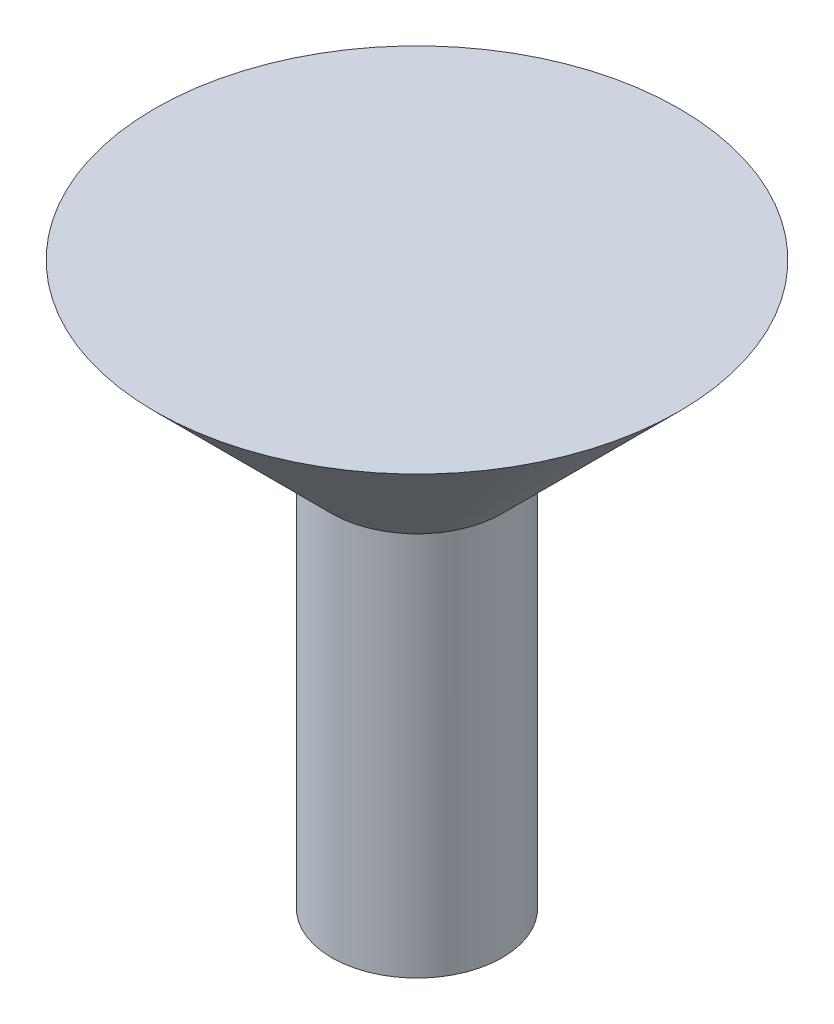
ISO-10303-21;
HEADER;
FILE_DESCRIPTION(('STEP AP214'),'2;1');
FILE_NAME('part.step','',(''),(''),'','','');
FILE_SCHEMA(('AUTOMOTIVE_DESIGN { 1 0 10303 214 1 1 1 1 }'));
ENDSEC;
DATA;
#1=APPLICATION_CONTEXT('core data for automotive mechanical design processes');
#2=APPLICATION_PROTOCOL_DEFINITION('international standard','automotive_design',2000,#1);
#3=PRODUCT_CONTEXT('',#1,'mechanical');
#4=PRODUCT('Part','Part','',(#3));
#5=PRODUCT_RELATED_PRODUCT_CATEGORY('part','',(#4));
#6=PRODUCT_DEFINITION_FORMATION('','',#4);
#7=PRODUCT_DEFINITION_CONTEXT('part definition',#1,'design');
#8=PRODUCT_DEFINITION('design','',#6,#7);
#9=PRODUCT_DEFINITION_SHAPE('','',#8);
#10=(LENGTH_UNIT() NAMED_UNIT(*) SI_UNIT(.MILLI.,.METRE.));
#11=(NAMED_UNIT(*) PLANE_ANGLE_UNIT() SI_UNIT($,.RADIAN.));
#12=(NAMED_UNIT(*) SI_UNIT($,.STERADIAN.) SOLID_ANGLE_UNIT());
#13=UNCERTAINTY_MEASURE_WITH_UNIT(LENGTH_MEASURE(1.E-05),#10,'distance_accuracy_value','');
#14=(GEOMETRIC_REPRESENTATION_CONTEXT(3) GLOBAL_UNCERTAINTY_ASSIGNED_CONTEXT((#13)) GLOBAL_UNIT_ASSIGNED_CONTEXT((#10,
#11,#12)) REPRESENTATION_CONTEXT('',''));
#15=CARTESIAN_POINT('',(0.,0.,0.));
#16=DIRECTION('',(0.,0.,1.));
#17=DIRECTION('',(1.,0.,0.));
#18=AXIS2_PLACEMENT_3D('',#15,#16,#17);
#19=CARTESIAN_POINT('',(-7.01715728752538,2.3,0.));
#20=DIRECTION('',(0.,1.,0.));
#21=DIRECTION('',(0.,0.,1.));
#22=AXIS2_PLACEMENT_3D('',#19,#20,#21);
#23=PLANE('',#22);
#24=CARTESIAN_POINT('',(-0.199999999999999,2.3,0.));
#25=DIRECTION('',(0.,1.,0.));
#26=DIRECTION('',(0.,0.,1.));
#27=AXIS2_PLACEMENT_3D('',#24,#25,#26);
#28=CIRCLE('',#27,6.81715728752538);
#29=CARTESIAN_POINT('',(-0.199999999999999,2.3,6.81715728752538));
#30=VERTEX_POINT('',#29);
#31=EDGE_CURVE('E10',#30,#30,#28,.T.);
#32=ORIENTED_EDGE('',*,*,#31,.T.);
#33=EDGE_LOOP('',(#32));
#34=FACE_BOUND('',#33,.T.);
#35=ADVANCED_FACE('F37',(#34),#23,.T.);
#36=CARTESIAN_POINT('',(-0.199999999999999,2.3,0.));
#37=DIRECTION('',(0.,1.,0.));
#38=DIRECTION('',(0.,0.,1.));
#39=AXIS2_PLACEMENT_3D('',#36,#37,#38);
#40=CONICAL_SURFACE('',#39,6.81715728752538,0.785398163397448);
#41=CARTESIAN_POINT('',(-0.199999999999999,-2.3,0.));
#42=DIRECTION('',(0.,-1.,0.));
#43=DIRECTION('',(0.,0.,-1.));
#44=AXIS2_PLACEMENT_3D('',#41,#42,#43);
#45=CIRCLE('',#44,2.21715728752538);
#46=CARTESIAN_POINT('',(-0.199999999999999,-2.3,2.21715728752538));
#47=VERTEX_POINT('',#46);
#48=EDGE_CURVE('E47',#47,#47,#45,.T.);
#49=CARTESIAN_POINT('',(-0.199999999999999,-2.3,2.21715728752538));
#50=CARTESIAN_POINT('',(-0.199999999999999,-2.25208333333333,2.26507395419205));
#51=CARTESIAN_POINT('',(-0.199999999999999,-2.20416666666667,2.31299062085871));
#52=CARTESIAN_POINT('',(-0.199999999999999,-2.10833333333333,2.40882395419205));
#53=CARTESIAN_POINT('',(-0.199999999999999,-2.06041666666667,2.45674062085871));
#54=CARTESIAN_POINT('',(-0.199999999999999,-1.96458333333333,2.55257395419205));
#55=CARTESIAN_POINT('',(-0.199999999999999,-1.91666666666667,2.60049062085871));
#56=CARTESIAN_POINT('',(-0.199999999999999,-1.82083333333333,2.69632395419205));
#57=CARTESIAN_POINT('',(-0.199999999999999,-1.77291666666667,2.74424062085871));
#58=CARTESIAN_POINT('',(-0.199999999999999,-1.67708333333333,2.84007395419205));
#59=CARTESIAN_POINT('',(-0.199999999999999,-1.62916666666667,2.88799062085871));
#60=CARTESIAN_POINT('',(-0.199999999999999,-1.53333333333333,2.98382395419205));
#61=CARTESIAN_POINT('',(-0.199999999999999,-1.48541666666667,3.03174062085871));
#62=CARTESIAN_POINT('',(-0.199999999999999,-1.38958333333333,3.12757395419205));
#63=CARTESIAN_POINT('',(-0.199999999999999,-1.34166666666667,3.17549062085871));
#64=CARTESIAN_POINT('',(-0.199999999999999,-1.24583333333333,3.27132395419205));
#65=CARTESIAN_POINT('',(-0.199999999999999,-1.19791666666667,3.31924062085871));
#66=CARTESIAN_POINT('',(-0.199999999999999,-1.10208333333333,3.41507395419205));
#67=CARTESIAN_POINT('',(-0.199999999999999,-1.05416666666667,3.46299062085871));
#68=CARTESIAN_POINT('',(-0.199999999999999,-0.958333333333333,3.55882395419205));
#69=CARTESIAN_POINT('',(-0.199999999999999,-0.910416666666667,3.60674062085871));
#70=CARTESIAN_POINT('',(-0.199999999999999,-0.814583333333333,3.70257395419205));
#71=CARTESIAN_POINT('',(-0.199999999999999,-0.766666666666666,3.75049062085871));
#72=CARTESIAN_POINT('',(-0.199999999999999,-0.670833333333333,3.84632395419205));
#73=CARTESIAN_POINT('',(-0.199999999999999,-0.622916666666667,3.89424062085871));
#74=CARTESIAN_POINT('',(-0.199999999999999,-0.527083333333333,3.99007395419205));
#75=CARTESIAN_POINT('',(-0.199999999999999,-0.479166666666667,4.03799062085871));
#76=CARTESIAN_POINT('',(-0.199999999999999,-0.383333333333333,4.13382395419205));
#77=CARTESIAN_POINT('',(-0.199999999999999,-0.335416666666667,4.18174062085872));
#78=CARTESIAN_POINT('',(-0.199999999999999,-0.239583333333333,4.27757395419205));
#79=CARTESIAN_POINT('',(-0.199999999999999,-0.191666666666667,4.32549062085871));
#80=CARTESIAN_POINT('',(-0.199999999999999,-0.0958333333333331,4.42132395419205));
#81=CARTESIAN_POINT('',(-0.199999999999999,-0.0479166666666666,4.46924062085871));
#82=CARTESIAN_POINT('',(-0.199999999999999,0.0479166666666666,4.56507395419205));
#83=CARTESIAN_POINT('',(-0.199999999999999,0.0958333333333331,4.61299062085871));
#84=CARTESIAN_POINT('',(-0.199999999999999,0.191666666666667,4.70882395419205));
#85=CARTESIAN_POINT('',(-0.199999999999999,0.239583333333333,4.75674062085871));
#86=CARTESIAN_POINT('',(-0.199999999999999,0.335416666666667,4.85257395419205));
#87=CARTESIAN_POINT('',(-0.199999999999999,0.383333333333333,4.90049062085871));
#88=CARTESIAN_POINT('',(-0.199999999999999,0.479166666666667,4.99632395419205));
#89=CARTESIAN_POINT('',(-0.199999999999999,0.527083333333333,5.04424062085871));
#90=CARTESIAN_POINT('',(-0.199999999999999,0.622916666666667,5.14007395419205));
#91=CARTESIAN_POINT('',(-0.199999999999999,0.670833333333333,5.18799062085871));
#92=CARTESIAN_POINT('',(-0.199999999999999,0.766666666666666,5.28382395419205));
#93=CARTESIAN_POINT('',(-0.199999999999999,0.814583333333333,5.33174062085871));
#94=CARTESIAN_POINT('',(-0.199999999999999,0.910416666666667,5.42757395419205));
#95=CARTESIAN_POINT('',(-0.199999999999999,0.958333333333333,5.47549062085871));
#96=CARTESIAN_POINT('',(-0.199999999999999,1.05416666666667,5.57132395419205));
#97=CARTESIAN_POINT('',(-0.199999999999999,1.10208333333333,5.61924062085871));
#98=CARTESIAN_POINT('',(-0.199999999999999,1.19791666666667,5.71507395419205));
#99=CARTESIAN_POINT('',(-0.199999999999999,1.24583333333333,5.76299062085871));
#100=CARTESIAN_POINT('',(-0.199999999999999,1.34166666666667,5.85882395419205));
#101=CARTESIAN_POINT('',(-0.199999999999999,1.38958333333333,5.90674062085871));
#102=CARTESIAN_POINT('',(-0.199999999999999,1.48541666666667,6.00257395419205));
#103=CARTESIAN_POINT('',(-0.199999999999999,1.53333333333333,6.05049062085871));
#104=CARTESIAN_POINT('',(-0.199999999999999,1.62916666666667,6.14632395419205));
#105=CARTESIAN_POINT('',(-0.199999999999999,1.67708333333333,6.19424062085871));
#106=CARTESIAN_POINT('',(-0.199999999999999,1.77291666666667,6.29007395419205));
#107=CARTESIAN_POINT('',(-0.199999999999999,1.82083333333333,6.33799062085871));
#108=CARTESIAN_POINT('',(-0.199999999999999,1.91666666666667,6.43382395419205));
#109=CARTESIAN_POINT('',(-0.199999999999999,1.96458333333333,6.48174062085871));
#110=CARTESIAN_POINT('',(-0.199999999999999,2.06041666666667,6.57757395419205));
#111=CARTESIAN_POINT('',(-0.199999999999999,2.10833333333333,6.62549062085871));
#112=CARTESIAN_POINT('',(-0.199999999999999,2.20416666666667,6.72132395419205));
#113=CARTESIAN_POINT('',(-0.199999999999999,2.25208333333333,6.76924062085871));
#114=CARTESIAN_POINT('',(-0.199999999999999,2.3,6.81715728752538));
#115=B_SPLINE_CURVE_WITH_KNOTS('',3,(#49,#50,#51,#52,#53,#54,#55,#56,#57,#58,#59,#60,#61,#62,
#63,#64,#65,#66,#67,#68,#69,#70,#71,#72,#73,#74,#75,#76,#77,#78,#79,#80,#81,#82,#83,#84,#85,#86,
#87,#88,#89,#90,#91,#92,#93,#94,#95,#96,#97,#98,#99,#100,#101,#102,#103,#104,#105,#106,#107,
#108,#109,#110,#111,#112,#113,#114),.UNSPECIFIED.,.F.,.F.,(4,2,2,2,2,2,2,2,2,2,2,2,2,2,2,2,2,2,
2,2,2,2,2,2,2,2,2,2,2,2,2,2,4),(0.,0.203293199591132,0.406586399182264,0.609879598773397,
0.81317279836453,1.01646599795566,1.21975919754679,1.42305239713793,1.62634559672906,
1.82963879632019,2.03293199591132,2.23622519550246,2.43951839509359,2.64281159468472,
2.84610479427585,3.04939799386699,3.25269119345812,3.45598439304925,3.65927759264038,
3.86257079223152,4.06586399182265,4.26915719141378,4.47245039100491,4.67574359059604,
4.87903679018718,5.08232998977831,5.28562318936944,5.48891638896057,5.69220958855171,
5.89550278814284,6.09879598773397,6.3020891873251,6.50538238691624),.UNSPECIFIED.);
#116=EDGE_CURVE('BSEAM75',#47,#30,#115,.T.);
#117=ORIENTED_EDGE('',*,*,#48,.F.);
#118=ORIENTED_EDGE('',*,*,#31,.F.);
#119=ORIENTED_EDGE('',*,*,#116,.T.);
#120=ORIENTED_EDGE('',*,*,#116,.F.);
#121=EDGE_LOOP('',(#117,#119,#118,#120));
#122=FACE_BOUND('',#121,.T.);
#123=ADVANCED_FACE('F75',(#122),#40,.T.);
#124=CARTESIAN_POINT('',(-0.199999999999999,-12.3,0.));
#125=DIRECTION('',(0.,1.,0.));
#126=DIRECTION('',(0.,0.,1.));
#127=AXIS2_PLACEMENT_3D('',#124,#125,#126);
#128=CYLINDRICAL_SURFACE('',#127,2.21715728752538);
#129=CARTESIAN_POINT('',(-0.199999999999999,-12.3,0.));
#130=DIRECTION('',(0.,-1.,0.));
#131=DIRECTION('',(0.,0.,-1.));
#132=AXIS2_PLACEMENT_3D('',#129,#130,#131);
#133=CIRCLE('',#132,2.21715728752538);
#134=CARTESIAN_POINT('',(-0.199999999999999,-12.3,-2.21715728752538));
#135=VERTEX_POINT('',#134);
#136=EDGE_CURVE('E43',#135,#135,#133,.T.);
#137=ORIENTED_EDGE('',*,*,#136,.F.);
#138=EDGE_LOOP('',(#137));
#139=FACE_BOUND('',#138,.T.);
#140=ORIENTED_EDGE('',*,*,#48,.T.);
#141=EDGE_LOOP('',(#140));
#142=FACE_BOUND('',#141,.T.);
#143=ADVANCED_FACE('F70',(#139,#142),#128,.T.);
#144=CARTESIAN_POINT('',(-0.199999999999999,-12.3,0.));
#145=DIRECTION('',(0.,-1.,0.));
#146=DIRECTION('',(0.,0.,-1.));
#147=AXIS2_PLACEMENT_3D('',#144,#145,#146);
#148=PLANE('',#147);
#149=CARTESIAN_POINT('',(-0.199999999999999,-12.3,0.));
#150=DIRECTION('',(0.,-1.,0.));
#151=DIRECTION('',(0.,0.,-1.));
#152=AXIS2_PLACEMENT_3D('',#149,#150,#151);
#153=CIRCLE('',#152,1.5);
#154=CARTESIAN_POINT('',(-0.199999999999999,-12.3,-1.5));
#155=VERTEX_POINT('',#154);
#156=EDGE_CURVE('E54',#155,#155,#153,.T.);
#157=ORIENTED_EDGE('',*,*,#156,.F.);
#158=EDGE_LOOP('',(#157));
#159=FACE_BOUND('',#158,.T.);
#160=ORIENTED_EDGE('',*,*,#136,.T.);
#161=EDGE_LOOP('',(#160));
#162=FACE_BOUND('',#161,.T.);
#163=ADVANCED_FACE('F65',(#159,#162),#148,.T.);
#164=CARTESIAN_POINT('',(-0.199999999999999,-7.3,0.));
#165=DIRECTION('',(0.,-1.,0.));
#166=DIRECTION('',(0.,0.,-1.));
#167=AXIS2_PLACEMENT_3D('',#164,#165,#166);
#168=CYLINDRICAL_SURFACE('',#167,1.5);
#169=CARTESIAN_POINT('',(-0.199999999999999,-7.3,0.));
#170=DIRECTION('',(0.,-1.,0.));
#171=DIRECTION('',(0.,0.,-1.));
#172=AXIS2_PLACEMENT_3D('',#169,#170,#171);
#173=CIRCLE('',#172,1.5);
#174=CARTESIAN_POINT('',(-0.199999999999999,-7.3,-1.5));
#175=VERTEX_POINT('',#174);
#176=EDGE_CURVE('E52',#175,#175,#173,.T.);
#177=ORIENTED_EDGE('',*,*,#176,.F.);
#178=EDGE_LOOP('',(#177));
#179=FACE_BOUND('',#178,.T.);
#180=ORIENTED_EDGE('',*,*,#156,.T.);
#181=EDGE_LOOP('',(#180));
#182=FACE_BOUND('',#181,.T.);
#183=ADVANCED_FACE('F62',(#179,#182),#168,.F.);
#184=CARTESIAN_POINT('',(-0.199999999999999,-7.3,0.));
#185=DIRECTION('',(0.,-1.,0.));
#186=DIRECTION('',(0.,0.,-1.));
#187=AXIS2_PLACEMENT_3D('',#184,#185,#186);
#188=PLANE('',#187);
#189=ORIENTED_EDGE('',*,*,#176,.T.);
#190=EDGE_LOOP('',(#189));
#191=FACE_BOUND('',#190,.T.);
#192=ADVANCED_FACE('F60',(#191),#188,.T.);
#193=CLOSED_SHELL('',(#35,#123,#143,#163,#183,#192));
#194=MANIFOLD_SOLID_BREP('B2',#193);
#195=ADVANCED_BREP_SHAPE_REPRESENTATION('',(#18,#194),#14);
#196=SHAPE_DEFINITION_REPRESENTATION(#9,#195);
ENDSEC;
END-ISO-10303-21;
